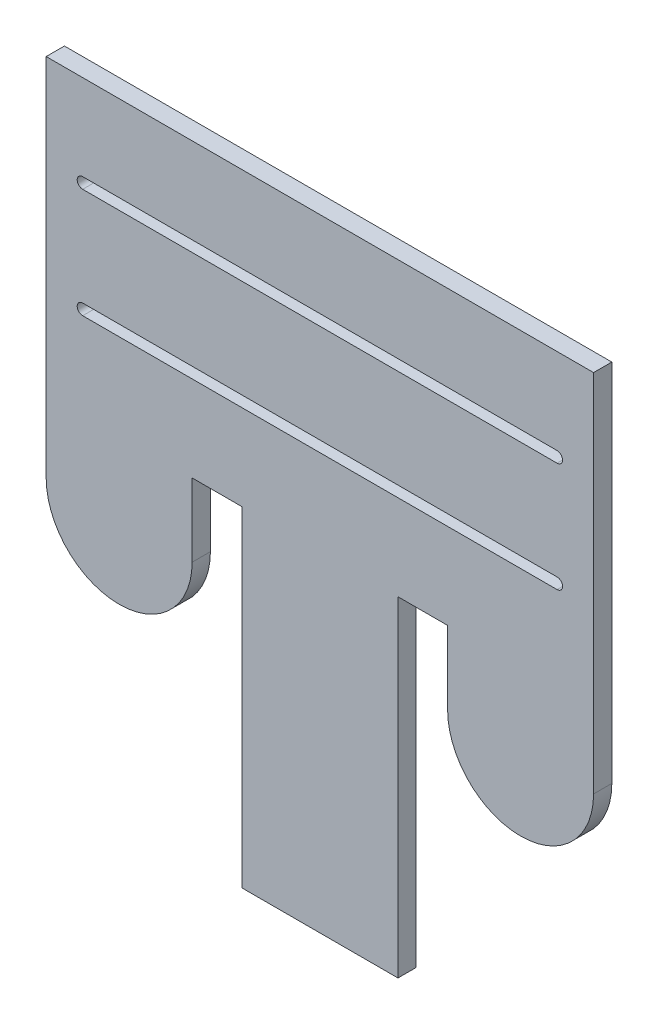
ISO-10303-21;
HEADER;
FILE_DESCRIPTION(('STEP AP214'),'2;1');
FILE_NAME('part.step','',(''),(''),'','','');
FILE_SCHEMA(('AUTOMOTIVE_DESIGN { 1 0 10303 214 1 1 1 1 }'));
ENDSEC;
DATA;
#1=APPLICATION_CONTEXT('core data for automotive mechanical design processes');
#2=APPLICATION_PROTOCOL_DEFINITION('international standard','automotive_design',2000,#1);
#3=PRODUCT_CONTEXT('',#1,'mechanical');
#4=PRODUCT('Part','Part','',(#3));
#5=PRODUCT_RELATED_PRODUCT_CATEGORY('part','',(#4));
#6=PRODUCT_DEFINITION_FORMATION('','',#4);
#7=PRODUCT_DEFINITION_CONTEXT('part definition',#1,'design');
#8=PRODUCT_DEFINITION('design','',#6,#7);
#9=PRODUCT_DEFINITION_SHAPE('','',#8);
#10=(LENGTH_UNIT() NAMED_UNIT(*) SI_UNIT(.MILLI.,.METRE.));
#11=(NAMED_UNIT(*) PLANE_ANGLE_UNIT() SI_UNIT($,.RADIAN.));
#12=(NAMED_UNIT(*) SI_UNIT($,.STERADIAN.) SOLID_ANGLE_UNIT());
#13=UNCERTAINTY_MEASURE_WITH_UNIT(LENGTH_MEASURE(1.E-05),#10,'distance_accuracy_value','');
#14=(GEOMETRIC_REPRESENTATION_CONTEXT(3) GLOBAL_UNCERTAINTY_ASSIGNED_CONTEXT((#13)) GLOBAL_UNIT_ASSIGNED_CONTEXT((#10,
#11,#12)) REPRESENTATION_CONTEXT('',''));
#15=CARTESIAN_POINT('',(0.,0.,0.));
#16=DIRECTION('',(0.,0.,1.));
#17=DIRECTION('',(1.,0.,0.));
#18=AXIS2_PLACEMENT_3D('',#15,#16,#17);
#19=CARTESIAN_POINT('',(0.,0.,0.));
#20=DIRECTION('',(0.,-1.,0.));
#21=DIRECTION('',(0.,0.,-1.));
#22=AXIS2_PLACEMENT_3D('',#19,#20,#21);
#23=PLANE('',#22);
#24=DIRECTION('',(1.,0.,0.));
#25=VECTOR('',#24,1.);
#26=CARTESIAN_POINT('',(0.,0.,0.));
#27=LINE('',#26,#25);
#28=CARTESIAN_POINT('',(122.428,0.,0.));
#29=VERTEX_POINT('',#28);
#30=CARTESIAN_POINT('',(139.7,0.,0.));
#31=VERTEX_POINT('',#30);
#32=EDGE_CURVE('E219',#29,#31,#27,.T.);
#33=ORIENTED_EDGE('',*,*,#32,.F.);
#34=DIRECTION('',(0.,0.,1.));
#35=VECTOR('',#34,1.);
#36=CARTESIAN_POINT('',(122.428,0.,0.));
#37=LINE('',#36,#35);
#38=CARTESIAN_POINT('',(122.428,0.,-6.35));
#39=VERTEX_POINT('',#38);
#40=EDGE_CURVE('E208',#39,#29,#37,.T.);
#41=ORIENTED_EDGE('',*,*,#40,.F.);
#42=DIRECTION('',(-1.,0.,0.));
#43=VECTOR('',#42,1.);
#44=CARTESIAN_POINT('',(0.,0.,-6.35));
#45=LINE('',#44,#43);
#46=CARTESIAN_POINT('',(139.7,0.,-6.35));
#47=VERTEX_POINT('',#46);
#48=EDGE_CURVE('E214',#47,#39,#45,.T.);
#49=ORIENTED_EDGE('',*,*,#48,.F.);
#50=DIRECTION('',(0.,0.,1.));
#51=VECTOR('',#50,1.);
#52=CARTESIAN_POINT('',(139.7,0.,-78.1920489685532));
#53=LINE('',#52,#51);
#54=EDGE_CURVE('E263',#47,#31,#53,.T.);
#55=ORIENTED_EDGE('',*,*,#54,.T.);
#56=EDGE_LOOP('',(#33,#41,#49,#55));
#57=FACE_BOUND('',#56,.T.);
#58=ADVANCED_FACE('F40',(#57),#23,.T.);
#59=CARTESIAN_POINT('',(68.072,0.,-6.35));
#60=VERTEX_POINT('',#59);
#61=CARTESIAN_POINT('',(50.8,0.,-6.35));
#62=VERTEX_POINT('',#61);
#63=EDGE_CURVE('E196',#60,#62,#45,.T.);
#64=ORIENTED_EDGE('',*,*,#63,.F.);
#65=DIRECTION('',(0.,0.,-1.));
#66=VECTOR('',#65,1.);
#67=CARTESIAN_POINT('',(68.072,0.,0.));
#68=LINE('',#67,#66);
#69=CARTESIAN_POINT('',(68.072,0.,0.));
#70=VERTEX_POINT('',#69);
#71=EDGE_CURVE('E203',#70,#60,#68,.T.);
#72=ORIENTED_EDGE('',*,*,#71,.F.);
#73=CARTESIAN_POINT('',(50.8,0.,0.));
#74=VERTEX_POINT('',#73);
#75=EDGE_CURVE('E215',#74,#70,#27,.T.);
#76=ORIENTED_EDGE('',*,*,#75,.F.);
#77=DIRECTION('',(0.,0.,1.));
#78=VECTOR('',#77,1.);
#79=CARTESIAN_POINT('',(50.8,0.,-78.1920489685532));
#80=LINE('',#79,#78);
#81=EDGE_CURVE('E212',#62,#74,#80,.T.);
#82=ORIENTED_EDGE('',*,*,#81,.F.);
#83=EDGE_LOOP('',(#64,#72,#76,#82));
#84=FACE_BOUND('',#83,.T.);
#85=ADVANCED_FACE('F210',(#84),#23,.T.);
#86=CARTESIAN_POINT('',(0.,101.6,0.));
#87=DIRECTION('',(1.,0.,0.));
#88=DIRECTION('',(0.,0.,-1.));
#89=AXIS2_PLACEMENT_3D('',#86,#87,#88);
#90=PLANE('',#89);
#91=DIRECTION('',(0.,-1.,0.));
#92=VECTOR('',#91,1.);
#93=CARTESIAN_POINT('',(0.,101.6,-6.35));
#94=LINE('',#93,#92);
#95=CARTESIAN_POINT('',(0.,101.6,-6.35));
#96=VERTEX_POINT('',#95);
#97=CARTESIAN_POINT('',(0.,-25.4,-6.35));
#98=VERTEX_POINT('',#97);
#99=EDGE_CURVE('E223',#96,#98,#94,.T.);
#100=ORIENTED_EDGE('',*,*,#99,.T.);
#101=DIRECTION('',(0.,0.,1.));
#102=VECTOR('',#101,1.);
#103=CARTESIAN_POINT('',(0.,-25.4,0.));
#104=LINE('',#103,#102);
#105=CARTESIAN_POINT('',(0.,-25.4,0.));
#106=VERTEX_POINT('',#105);
#107=EDGE_CURVE('E253',#98,#106,#104,.T.);
#108=ORIENTED_EDGE('',*,*,#107,.T.);
#109=DIRECTION('',(0.,-1.,0.));
#110=VECTOR('',#109,1.);
#111=CARTESIAN_POINT('',(0.,101.6,0.));
#112=LINE('',#111,#110);
#113=CARTESIAN_POINT('',(0.,101.6,0.));
#114=VERTEX_POINT('',#113);
#115=EDGE_CURVE('E232',#114,#106,#112,.T.);
#116=ORIENTED_EDGE('',*,*,#115,.F.);
#117=DIRECTION('',(0.,0.,1.));
#118=VECTOR('',#117,1.);
#119=CARTESIAN_POINT('',(0.,101.6,0.));
#120=LINE('',#119,#118);
#121=EDGE_CURVE('E218',#96,#114,#120,.T.);
#122=ORIENTED_EDGE('',*,*,#121,.F.);
#123=EDGE_LOOP('',(#100,#108,#116,#122));
#124=FACE_BOUND('',#123,.T.);
#125=ADVANCED_FACE('F369',(#124),#90,.F.);
#126=CARTESIAN_POINT('',(0.,101.6,0.));
#127=DIRECTION('',(0.,0.,-1.));
#128=DIRECTION('',(-1.,0.,0.));
#129=AXIS2_PLACEMENT_3D('',#126,#127,#128);
#130=PLANE('',#129);
#131=DIRECTION('',(1.,0.,0.));
#132=VECTOR('',#131,1.);
#133=CARTESIAN_POINT('',(177.8,71.755,0.));
#134=LINE('',#133,#132);
#135=CARTESIAN_POINT('',(12.7,71.755,0.));
#136=VERTEX_POINT('',#135);
#137=CARTESIAN_POINT('',(177.8,71.755,0.));
#138=VERTEX_POINT('',#137);
#139=EDGE_CURVE('E302',#136,#138,#134,.T.);
#140=ORIENTED_EDGE('',*,*,#139,.T.);
#141=CARTESIAN_POINT('',(177.8,69.85,0.));
#142=DIRECTION('',(0.,0.,-1.));
#143=DIRECTION('',(-1.,0.,0.));
#144=AXIS2_PLACEMENT_3D('',#141,#142,#143);
#145=CIRCLE('',#144,1.905);
#146=CARTESIAN_POINT('',(177.8,67.945,0.));
#147=VERTEX_POINT('',#146);
#148=EDGE_CURVE('E292',#138,#147,#145,.T.);
#149=ORIENTED_EDGE('',*,*,#148,.T.);
#150=DIRECTION('',(-1.,0.,0.));
#151=VECTOR('',#150,1.);
#152=CARTESIAN_POINT('',(177.8,67.945,0.));
#153=LINE('',#152,#151);
#154=CARTESIAN_POINT('',(12.7,67.945,0.));
#155=VERTEX_POINT('',#154);
#156=EDGE_CURVE('E295',#147,#155,#153,.T.);
#157=ORIENTED_EDGE('',*,*,#156,.T.);
#158=CARTESIAN_POINT('',(12.7,69.85,0.));
#159=DIRECTION('',(0.,0.,-1.));
#160=DIRECTION('',(1.,0.,0.));
#161=AXIS2_PLACEMENT_3D('',#158,#159,#160);
#162=CIRCLE('',#161,1.905);
#163=EDGE_CURVE('E299',#155,#136,#162,.T.);
#164=ORIENTED_EDGE('',*,*,#163,.T.);
#165=EDGE_LOOP('',(#140,#149,#157,#164));
#166=FACE_BOUND('',#165,.T.);
#167=DIRECTION('',(-1.,0.,0.));
#168=VECTOR('',#167,1.);
#169=CARTESIAN_POINT('',(177.8,29.845,0.));
#170=LINE('',#169,#168);
#171=CARTESIAN_POINT('',(177.8,29.845,0.));
#172=VERTEX_POINT('',#171);
#173=CARTESIAN_POINT('',(12.7,29.845,0.));
#174=VERTEX_POINT('',#173);
#175=EDGE_CURVE('E335',#172,#174,#170,.T.);
#176=ORIENTED_EDGE('',*,*,#175,.T.);
#177=CARTESIAN_POINT('',(12.7,31.75,0.));
#178=DIRECTION('',(0.,0.,-1.));
#179=DIRECTION('',(-1.,0.,0.));
#180=AXIS2_PLACEMENT_3D('',#177,#178,#179);
#181=CIRCLE('',#180,1.905);
#182=CARTESIAN_POINT('',(12.7,33.655,0.));
#183=VERTEX_POINT('',#182);
#184=EDGE_CURVE('E325',#174,#183,#181,.T.);
#185=ORIENTED_EDGE('',*,*,#184,.T.);
#186=DIRECTION('',(1.,0.,0.));
#187=VECTOR('',#186,1.);
#188=CARTESIAN_POINT('',(177.8,33.655,0.));
#189=LINE('',#188,#187);
#190=CARTESIAN_POINT('',(177.8,33.655,0.));
#191=VERTEX_POINT('',#190);
#192=EDGE_CURVE('E328',#183,#191,#189,.T.);
#193=ORIENTED_EDGE('',*,*,#192,.T.);
#194=CARTESIAN_POINT('',(177.8,31.75,0.));
#195=DIRECTION('',(0.,0.,-1.));
#196=DIRECTION('',(1.,0.,0.));
#197=AXIS2_PLACEMENT_3D('',#194,#195,#196);
#198=CIRCLE('',#197,1.905);
#199=EDGE_CURVE('E332',#191,#172,#198,.T.);
#200=ORIENTED_EDGE('',*,*,#199,.T.);
#201=EDGE_LOOP('',(#176,#185,#193,#200));
#202=FACE_BOUND('',#201,.T.);
#203=ORIENTED_EDGE('',*,*,#115,.T.);
#204=CARTESIAN_POINT('',(25.4,-25.4,0.));
#205=DIRECTION('',(0.,0.,-1.));
#206=DIRECTION('',(-1.,0.,0.));
#207=AXIS2_PLACEMENT_3D('',#204,#205,#206);
#208=CIRCLE('',#207,25.4);
#209=CARTESIAN_POINT('',(25.4,-50.8,0.));
#210=VERTEX_POINT('',#209);
#211=EDGE_CURVE('E244',#106,#210,#208,.F.);
#212=ORIENTED_EDGE('',*,*,#211,.T.);
#213=CARTESIAN_POINT('',(25.4,-25.4,0.));
#214=DIRECTION('',(0.,0.,-1.));
#215=DIRECTION('',(-1.,0.,0.));
#216=AXIS2_PLACEMENT_3D('',#213,#214,#215);
#217=CIRCLE('',#216,25.4);
#218=CARTESIAN_POINT('',(50.8,-25.4,0.));
#219=VERTEX_POINT('',#218);
#220=EDGE_CURVE('E242',#210,#219,#217,.F.);
#221=ORIENTED_EDGE('',*,*,#220,.T.);
#222=DIRECTION('',(0.,1.,0.));
#223=VECTOR('',#222,1.);
#224=CARTESIAN_POINT('',(50.8,0.,0.));
#225=LINE('',#224,#223);
#226=EDGE_CURVE('E283',#219,#74,#225,.T.);
#227=ORIENTED_EDGE('',*,*,#226,.T.);
#228=ORIENTED_EDGE('',*,*,#75,.T.);
#229=DIRECTION('',(0.,1.,0.));
#230=VECTOR('',#229,1.);
#231=CARTESIAN_POINT('',(68.072,-169.627254276582,0.));
#232=LINE('',#231,#230);
#233=CARTESIAN_POINT('',(68.072,-114.9016,0.));
#234=VERTEX_POINT('',#233);
#235=EDGE_CURVE('E57',#234,#70,#232,.T.);
#236=ORIENTED_EDGE('',*,*,#235,.F.);
#237=DIRECTION('',(1.,0.,0.));
#238=VECTOR('',#237,1.);
#239=CARTESIAN_POINT('',(68.072,-114.9016,0.));
#240=LINE('',#239,#238);
#241=CARTESIAN_POINT('',(122.428,-114.9016,0.));
#242=VERTEX_POINT('',#241);
#243=EDGE_CURVE('E200',#234,#242,#240,.T.);
#244=ORIENTED_EDGE('',*,*,#243,.T.);
#245=DIRECTION('',(0.,1.,0.));
#246=VECTOR('',#245,1.);
#247=CARTESIAN_POINT('',(122.428,-169.627254276582,0.));
#248=LINE('',#247,#246);
#249=EDGE_CURVE('E277',#242,#29,#248,.T.);
#250=ORIENTED_EDGE('',*,*,#249,.T.);
#251=ORIENTED_EDGE('',*,*,#32,.T.);
#252=DIRECTION('',(0.,-1.,0.));
#253=VECTOR('',#252,1.);
#254=CARTESIAN_POINT('',(139.7,0.,0.));
#255=LINE('',#254,#253);
#256=CARTESIAN_POINT('',(139.7,-25.4,0.));
#257=VERTEX_POINT('',#256);
#258=EDGE_CURVE('E258',#31,#257,#255,.T.);
#259=ORIENTED_EDGE('',*,*,#258,.T.);
#260=CARTESIAN_POINT('',(165.1,-25.4,0.));
#261=DIRECTION('',(0.,0.,-1.));
#262=DIRECTION('',(-1.,0.,0.));
#263=AXIS2_PLACEMENT_3D('',#260,#261,#262);
#264=CIRCLE('',#263,25.4);
#265=CARTESIAN_POINT('',(165.1,-50.8,0.));
#266=VERTEX_POINT('',#265);
#267=EDGE_CURVE('E240',#257,#266,#264,.F.);
#268=ORIENTED_EDGE('',*,*,#267,.T.);
#269=CARTESIAN_POINT('',(165.1,-25.4,0.));
#270=DIRECTION('',(0.,0.,-1.));
#271=DIRECTION('',(-1.,0.,0.));
#272=AXIS2_PLACEMENT_3D('',#269,#270,#271);
#273=CIRCLE('',#272,25.4);
#274=CARTESIAN_POINT('',(190.5,-25.4,0.));
#275=VERTEX_POINT('',#274);
#276=EDGE_CURVE('E238',#266,#275,#273,.F.);
#277=ORIENTED_EDGE('',*,*,#276,.T.);
#278=DIRECTION('',(0.,-1.,0.));
#279=VECTOR('',#278,1.);
#280=CARTESIAN_POINT('',(190.5,101.6,0.));
#281=LINE('',#280,#279);
#282=CARTESIAN_POINT('',(190.5,101.6,0.));
#283=VERTEX_POINT('',#282);
#284=EDGE_CURVE('E229',#283,#275,#281,.T.);
#285=ORIENTED_EDGE('',*,*,#284,.F.);
#286=DIRECTION('',(1.,0.,0.));
#287=VECTOR('',#286,1.);
#288=CARTESIAN_POINT('',(0.,101.6,0.));
#289=LINE('',#288,#287);
#290=EDGE_CURVE('E357',#114,#283,#289,.T.);
#291=ORIENTED_EDGE('',*,*,#290,.F.);
#292=EDGE_LOOP('',(#203,#212,#221,#227,#228,#236,#244,#250,#251,#259,#268,#277,#285,#291));
#293=FACE_BOUND('',#292,.T.);
#294=ADVANCED_FACE('F371',(#166,#202,#293),#130,.F.);
#295=CARTESIAN_POINT('',(190.5,101.6,0.));
#296=DIRECTION('',(-1.,0.,0.));
#297=DIRECTION('',(0.,0.,1.));
#298=AXIS2_PLACEMENT_3D('',#295,#296,#297);
#299=PLANE('',#298);
#300=ORIENTED_EDGE('',*,*,#284,.T.);
#301=DIRECTION('',(0.,0.,1.));
#302=VECTOR('',#301,1.);
#303=CARTESIAN_POINT('',(190.5,-25.4,-6.34999999999999));
#304=LINE('',#303,#302);
#305=CARTESIAN_POINT('',(190.5,-25.4,-6.35));
#306=VERTEX_POINT('',#305);
#307=EDGE_CURVE('E11',#275,#306,#304,.F.);
#308=ORIENTED_EDGE('',*,*,#307,.T.);
#309=DIRECTION('',(0.,-1.,0.));
#310=VECTOR('',#309,1.);
#311=CARTESIAN_POINT('',(190.5,101.6,-6.35));
#312=LINE('',#311,#310);
#313=CARTESIAN_POINT('',(190.5,101.6,-6.35));
#314=VERTEX_POINT('',#313);
#315=EDGE_CURVE('E225',#314,#306,#312,.T.);
#316=ORIENTED_EDGE('',*,*,#315,.F.);
#317=DIRECTION('',(0.,0.,-1.));
#318=VECTOR('',#317,1.);
#319=CARTESIAN_POINT('',(190.5,101.6,0.));
#320=LINE('',#319,#318);
#321=EDGE_CURVE('E359',#283,#314,#320,.T.);
#322=ORIENTED_EDGE('',*,*,#321,.F.);
#323=EDGE_LOOP('',(#300,#308,#316,#322));
#324=FACE_BOUND('',#323,.T.);
#325=ADVANCED_FACE('F377',(#324),#299,.F.);
#326=CARTESIAN_POINT('',(0.,101.6,-6.35));
#327=DIRECTION('',(0.,0.,1.));
#328=DIRECTION('',(1.,0.,0.));
#329=AXIS2_PLACEMENT_3D('',#326,#327,#328);
#330=PLANE('',#329);
#331=DIRECTION('',(-1.,0.,0.));
#332=VECTOR('',#331,1.);
#333=CARTESIAN_POINT('',(177.8,67.945,-6.35));
#334=LINE('',#333,#332);
#335=CARTESIAN_POINT('',(177.8,67.945,-6.35));
#336=VERTEX_POINT('',#335);
#337=CARTESIAN_POINT('',(12.7,67.945,-6.35));
#338=VERTEX_POINT('',#337);
#339=EDGE_CURVE('E308',#336,#338,#334,.T.);
#340=ORIENTED_EDGE('',*,*,#339,.F.);
#341=CARTESIAN_POINT('',(177.8,69.85,-6.35));
#342=DIRECTION('',(0.,0.,-1.));
#343=DIRECTION('',(-1.,0.,0.));
#344=AXIS2_PLACEMENT_3D('',#341,#342,#343);
#345=CIRCLE('',#344,1.905);
#346=CARTESIAN_POINT('',(177.8,71.755,-6.35));
#347=VERTEX_POINT('',#346);
#348=EDGE_CURVE('E306',#347,#336,#345,.T.);
#349=ORIENTED_EDGE('',*,*,#348,.F.);
#350=DIRECTION('',(1.,0.,0.));
#351=VECTOR('',#350,1.);
#352=CARTESIAN_POINT('',(177.8,71.755,-6.35));
#353=LINE('',#352,#351);
#354=CARTESIAN_POINT('',(12.7,71.755,-6.35));
#355=VERTEX_POINT('',#354);
#356=EDGE_CURVE('E296',#355,#347,#353,.T.);
#357=ORIENTED_EDGE('',*,*,#356,.F.);
#358=CARTESIAN_POINT('',(12.7,69.85,-6.35));
#359=DIRECTION('',(0.,0.,-1.));
#360=DIRECTION('',(1.,0.,0.));
#361=AXIS2_PLACEMENT_3D('',#358,#359,#360);
#362=CIRCLE('',#361,1.905);
#363=EDGE_CURVE('E312',#338,#355,#362,.T.);
#364=ORIENTED_EDGE('',*,*,#363,.F.);
#365=EDGE_LOOP('',(#340,#349,#357,#364));
#366=FACE_BOUND('',#365,.T.);
#367=DIRECTION('',(1.,0.,0.));
#368=VECTOR('',#367,1.);
#369=CARTESIAN_POINT('',(177.8,33.655,-6.35));
#370=LINE('',#369,#368);
#371=CARTESIAN_POINT('',(12.7,33.655,-6.35));
#372=VERTEX_POINT('',#371);
#373=CARTESIAN_POINT('',(177.8,33.655,-6.35));
#374=VERTEX_POINT('',#373);
#375=EDGE_CURVE('E340',#372,#374,#370,.T.);
#376=ORIENTED_EDGE('',*,*,#375,.F.);
#377=CARTESIAN_POINT('',(12.7,31.75,-6.35));
#378=DIRECTION('',(0.,0.,-1.));
#379=DIRECTION('',(-1.,0.,0.));
#380=AXIS2_PLACEMENT_3D('',#377,#378,#379);
#381=CIRCLE('',#380,1.905);
#382=CARTESIAN_POINT('',(12.7,29.845,-6.35));
#383=VERTEX_POINT('',#382);
#384=EDGE_CURVE('E289',#383,#372,#381,.T.);
#385=ORIENTED_EDGE('',*,*,#384,.F.);
#386=DIRECTION('',(-1.,0.,0.));
#387=VECTOR('',#386,1.);
#388=CARTESIAN_POINT('',(177.8,29.845,-6.35));
#389=LINE('',#388,#387);
#390=CARTESIAN_POINT('',(177.8,29.845,-6.35));
#391=VERTEX_POINT('',#390);
#392=EDGE_CURVE('E329',#391,#383,#389,.T.);
#393=ORIENTED_EDGE('',*,*,#392,.F.);
#394=CARTESIAN_POINT('',(177.8,31.75,-6.35));
#395=DIRECTION('',(0.,0.,-1.));
#396=DIRECTION('',(1.,0.,0.));
#397=AXIS2_PLACEMENT_3D('',#394,#395,#396);
#398=CIRCLE('',#397,1.905);
#399=EDGE_CURVE('E343',#374,#391,#398,.T.);
#400=ORIENTED_EDGE('',*,*,#399,.F.);
#401=EDGE_LOOP('',(#376,#385,#393,#400));
#402=FACE_BOUND('',#401,.T.);
#403=CARTESIAN_POINT('',(25.4,-25.4,-6.34999999999999));
#404=DIRECTION('',(0.,0.,1.));
#405=DIRECTION('',(1.,0.,0.));
#406=AXIS2_PLACEMENT_3D('',#403,#404,#405);
#407=CIRCLE('',#406,25.4);
#408=CARTESIAN_POINT('',(50.8,-25.4,-6.34999999999999));
#409=VERTEX_POINT('',#408);
#410=CARTESIAN_POINT('',(25.4,-50.8,-6.34999999999999));
#411=VERTEX_POINT('',#410);
#412=EDGE_CURVE('E250',#409,#411,#407,.F.);
#413=ORIENTED_EDGE('',*,*,#412,.T.);
#414=CARTESIAN_POINT('',(25.4,-25.4,-6.35));
#415=DIRECTION('',(0.,0.,1.));
#416=DIRECTION('',(1.,0.,0.));
#417=AXIS2_PLACEMENT_3D('',#414,#415,#416);
#418=CIRCLE('',#417,25.4);
#419=EDGE_CURVE('E65',#411,#98,#418,.F.);
#420=ORIENTED_EDGE('',*,*,#419,.T.);
#421=ORIENTED_EDGE('',*,*,#99,.F.);
#422=DIRECTION('',(-1.,0.,0.));
#423=VECTOR('',#422,1.);
#424=CARTESIAN_POINT('',(0.,101.6,-6.35));
#425=LINE('',#424,#423);
#426=EDGE_CURVE('E226',#314,#96,#425,.T.);
#427=ORIENTED_EDGE('',*,*,#426,.F.);
#428=ORIENTED_EDGE('',*,*,#315,.T.);
#429=CARTESIAN_POINT('',(165.1,-25.4,-6.34999999999999));
#430=DIRECTION('',(0.,0.,1.));
#431=DIRECTION('',(1.,0.,0.));
#432=AXIS2_PLACEMENT_3D('',#429,#430,#431);
#433=CIRCLE('',#432,25.4);
#434=CARTESIAN_POINT('',(165.1,-50.8,-6.34999999999999));
#435=VERTEX_POINT('',#434);
#436=EDGE_CURVE('E246',#306,#435,#433,.F.);
#437=ORIENTED_EDGE('',*,*,#436,.T.);
#438=CARTESIAN_POINT('',(165.1,-25.4,-6.34999999999999));
#439=DIRECTION('',(0.,0.,1.));
#440=DIRECTION('',(1.,0.,0.));
#441=AXIS2_PLACEMENT_3D('',#438,#439,#440);
#442=CIRCLE('',#441,25.4);
#443=CARTESIAN_POINT('',(139.7,-25.4,-6.34999999999999));
#444=VERTEX_POINT('',#443);
#445=EDGE_CURVE('E248',#435,#444,#442,.F.);
#446=ORIENTED_EDGE('',*,*,#445,.T.);
#447=DIRECTION('',(0.,1.,0.));
#448=VECTOR('',#447,1.);
#449=CARTESIAN_POINT('',(139.7,0.,-6.34999999999999));
#450=LINE('',#449,#448);
#451=EDGE_CURVE('E282',#444,#47,#450,.T.);
#452=ORIENTED_EDGE('',*,*,#451,.T.);
#453=ORIENTED_EDGE('',*,*,#48,.T.);
#454=DIRECTION('',(0.,1.,0.));
#455=VECTOR('',#454,1.);
#456=CARTESIAN_POINT('',(122.428,-169.627254276582,-6.35));
#457=LINE('',#456,#455);
#458=CARTESIAN_POINT('',(122.428,-114.9016,-6.35));
#459=VERTEX_POINT('',#458);
#460=EDGE_CURVE('E201',#459,#39,#457,.T.);
#461=ORIENTED_EDGE('',*,*,#460,.F.);
#462=DIRECTION('',(-1.,0.,0.));
#463=VECTOR('',#462,1.);
#464=CARTESIAN_POINT('',(68.072,-114.9016,-6.35));
#465=LINE('',#464,#463);
#466=CARTESIAN_POINT('',(68.072,-114.9016,-6.35));
#467=VERTEX_POINT('',#466);
#468=EDGE_CURVE('E199',#459,#467,#465,.T.);
#469=ORIENTED_EDGE('',*,*,#468,.T.);
#470=DIRECTION('',(0.,1.,0.));
#471=VECTOR('',#470,1.);
#472=CARTESIAN_POINT('',(68.072,-169.627254276582,-6.35));
#473=LINE('',#472,#471);
#474=EDGE_CURVE('E192',#467,#60,#473,.T.);
#475=ORIENTED_EDGE('',*,*,#474,.T.);
#476=ORIENTED_EDGE('',*,*,#63,.T.);
#477=DIRECTION('',(0.,-1.,0.));
#478=VECTOR('',#477,1.);
#479=CARTESIAN_POINT('',(50.8,0.,-6.34999999999999));
#480=LINE('',#479,#478);
#481=EDGE_CURVE('E287',#62,#409,#480,.T.);
#482=ORIENTED_EDGE('',*,*,#481,.T.);
#483=EDGE_LOOP('',(#413,#420,#421,#427,#428,#437,#446,#452,#453,#461,#469,#475,#476,#482));
#484=FACE_BOUND('',#483,.T.);
#485=ADVANCED_FACE('F193',(#366,#402,#484),#330,.F.);
#486=CARTESIAN_POINT('',(0.,101.6,0.));
#487=DIRECTION('',(0.,-1.,0.));
#488=DIRECTION('',(0.,0.,-1.));
#489=AXIS2_PLACEMENT_3D('',#486,#487,#488);
#490=PLANE('',#489);
#491=ORIENTED_EDGE('',*,*,#121,.T.);
#492=ORIENTED_EDGE('',*,*,#290,.T.);
#493=ORIENTED_EDGE('',*,*,#321,.T.);
#494=ORIENTED_EDGE('',*,*,#426,.T.);
#495=EDGE_LOOP('',(#491,#492,#493,#494));
#496=FACE_BOUND('',#495,.T.);
#497=ADVANCED_FACE('F362',(#496),#490,.F.);
#498=CARTESIAN_POINT('',(12.7,31.75,0.));
#499=DIRECTION('',(0.,0.,-1.));
#500=DIRECTION('',(-1.,0.,0.));
#501=AXIS2_PLACEMENT_3D('',#498,#499,#500);
#502=CYLINDRICAL_SURFACE('',#501,1.905);
#503=ORIENTED_EDGE('',*,*,#384,.T.);
#504=DIRECTION('',(0.,0.,-1.));
#505=VECTOR('',#504,1.);
#506=CARTESIAN_POINT('',(12.7,33.655,0.));
#507=LINE('',#506,#505);
#508=EDGE_CURVE('E338',#183,#372,#507,.T.);
#509=ORIENTED_EDGE('',*,*,#508,.F.);
#510=ORIENTED_EDGE('',*,*,#184,.F.);
#511=DIRECTION('',(0.,0.,-1.));
#512=VECTOR('',#511,1.);
#513=CARTESIAN_POINT('',(12.7,29.845,0.));
#514=LINE('',#513,#512);
#515=EDGE_CURVE('E309',#174,#383,#514,.T.);
#516=ORIENTED_EDGE('',*,*,#515,.T.);
#517=EDGE_LOOP('',(#503,#509,#510,#516));
#518=FACE_BOUND('',#517,.T.);
#519=ADVANCED_FACE('F463',(#518),#502,.F.);
#520=CARTESIAN_POINT('',(177.8,29.845,0.));
#521=DIRECTION('',(0.,-1.,0.));
#522=DIRECTION('',(0.,0.,-1.));
#523=AXIS2_PLACEMENT_3D('',#520,#521,#522);
#524=PLANE('',#523);
#525=ORIENTED_EDGE('',*,*,#392,.T.);
#526=ORIENTED_EDGE('',*,*,#515,.F.);
#527=ORIENTED_EDGE('',*,*,#175,.F.);
#528=DIRECTION('',(0.,0.,-1.));
#529=VECTOR('',#528,1.);
#530=CARTESIAN_POINT('',(177.8,29.845,0.));
#531=LINE('',#530,#529);
#532=EDGE_CURVE('E349',#172,#391,#531,.T.);
#533=ORIENTED_EDGE('',*,*,#532,.T.);
#534=EDGE_LOOP('',(#525,#526,#527,#533));
#535=FACE_BOUND('',#534,.T.);
#536=ADVANCED_FACE('F459',(#535),#524,.F.);
#537=CARTESIAN_POINT('',(177.8,31.75,0.));
#538=DIRECTION('',(0.,0.,-1.));
#539=DIRECTION('',(-1.,0.,0.));
#540=AXIS2_PLACEMENT_3D('',#537,#538,#539);
#541=CYLINDRICAL_SURFACE('',#540,1.905);
#542=ORIENTED_EDGE('',*,*,#399,.T.);
#543=ORIENTED_EDGE('',*,*,#532,.F.);
#544=ORIENTED_EDGE('',*,*,#199,.F.);
#545=DIRECTION('',(0.,0.,-1.));
#546=VECTOR('',#545,1.);
#547=CARTESIAN_POINT('',(177.8,33.655,0.));
#548=LINE('',#547,#546);
#549=EDGE_CURVE('E351',#191,#374,#548,.T.);
#550=ORIENTED_EDGE('',*,*,#549,.T.);
#551=EDGE_LOOP('',(#542,#543,#544,#550));
#552=FACE_BOUND('',#551,.T.);
#553=ADVANCED_FACE('F462',(#552),#541,.F.);
#554=CARTESIAN_POINT('',(177.8,33.655,0.));
#555=DIRECTION('',(0.,1.,0.));
#556=DIRECTION('',(0.,0.,1.));
#557=AXIS2_PLACEMENT_3D('',#554,#555,#556);
#558=PLANE('',#557);
#559=ORIENTED_EDGE('',*,*,#375,.T.);
#560=ORIENTED_EDGE('',*,*,#549,.F.);
#561=ORIENTED_EDGE('',*,*,#192,.F.);
#562=ORIENTED_EDGE('',*,*,#508,.T.);
#563=EDGE_LOOP('',(#559,#560,#561,#562));
#564=FACE_BOUND('',#563,.T.);
#565=ADVANCED_FACE('F457',(#564),#558,.F.);
#566=CARTESIAN_POINT('',(177.8,69.85,0.));
#567=DIRECTION('',(0.,0.,-1.));
#568=DIRECTION('',(-1.,0.,0.));
#569=AXIS2_PLACEMENT_3D('',#566,#567,#568);
#570=CYLINDRICAL_SURFACE('',#569,1.905);
#571=ORIENTED_EDGE('',*,*,#348,.T.);
#572=DIRECTION('',(0.,0.,-1.));
#573=VECTOR('',#572,1.);
#574=CARTESIAN_POINT('',(177.8,67.945,0.));
#575=LINE('',#574,#573);
#576=EDGE_CURVE('E305',#147,#336,#575,.T.);
#577=ORIENTED_EDGE('',*,*,#576,.F.);
#578=ORIENTED_EDGE('',*,*,#148,.F.);
#579=DIRECTION('',(0.,0.,-1.));
#580=VECTOR('',#579,1.);
#581=CARTESIAN_POINT('',(177.8,71.755,0.));
#582=LINE('',#581,#580);
#583=EDGE_CURVE('E317',#138,#347,#582,.T.);
#584=ORIENTED_EDGE('',*,*,#583,.T.);
#585=EDGE_LOOP('',(#571,#577,#578,#584));
#586=FACE_BOUND('',#585,.T.);
#587=ADVANCED_FACE('F447',(#586),#570,.F.);
#588=CARTESIAN_POINT('',(177.8,71.755,0.));
#589=DIRECTION('',(0.,1.,0.));
#590=DIRECTION('',(0.,0.,1.));
#591=AXIS2_PLACEMENT_3D('',#588,#589,#590);
#592=PLANE('',#591);
#593=ORIENTED_EDGE('',*,*,#356,.T.);
#594=ORIENTED_EDGE('',*,*,#583,.F.);
#595=ORIENTED_EDGE('',*,*,#139,.F.);
#596=DIRECTION('',(0.,0.,-1.));
#597=VECTOR('',#596,1.);
#598=CARTESIAN_POINT('',(12.7,71.755,0.));
#599=LINE('',#598,#597);
#600=EDGE_CURVE('E319',#136,#355,#599,.T.);
#601=ORIENTED_EDGE('',*,*,#600,.T.);
#602=EDGE_LOOP('',(#593,#594,#595,#601));
#603=FACE_BOUND('',#602,.T.);
#604=ADVANCED_FACE('F443',(#603),#592,.F.);
#605=CARTESIAN_POINT('',(12.7,69.85,0.));
#606=DIRECTION('',(0.,0.,-1.));
#607=DIRECTION('',(-1.,0.,0.));
#608=AXIS2_PLACEMENT_3D('',#605,#606,#607);
#609=CYLINDRICAL_SURFACE('',#608,1.905);
#610=ORIENTED_EDGE('',*,*,#363,.T.);
#611=ORIENTED_EDGE('',*,*,#600,.F.);
#612=ORIENTED_EDGE('',*,*,#163,.F.);
#613=DIRECTION('',(0.,0.,-1.));
#614=VECTOR('',#613,1.);
#615=CARTESIAN_POINT('',(12.7,67.945,0.));
#616=LINE('',#615,#614);
#617=EDGE_CURVE('E321',#155,#338,#616,.T.);
#618=ORIENTED_EDGE('',*,*,#617,.T.);
#619=EDGE_LOOP('',(#610,#611,#612,#618));
#620=FACE_BOUND('',#619,.T.);
#621=ADVANCED_FACE('F446',(#620),#609,.F.);
#622=CARTESIAN_POINT('',(177.8,67.945,0.));
#623=DIRECTION('',(0.,-1.,0.));
#624=DIRECTION('',(0.,0.,-1.));
#625=AXIS2_PLACEMENT_3D('',#622,#623,#624);
#626=PLANE('',#625);
#627=ORIENTED_EDGE('',*,*,#339,.T.);
#628=ORIENTED_EDGE('',*,*,#617,.F.);
#629=ORIENTED_EDGE('',*,*,#156,.F.);
#630=ORIENTED_EDGE('',*,*,#576,.T.);
#631=EDGE_LOOP('',(#627,#628,#629,#630));
#632=FACE_BOUND('',#631,.T.);
#633=ADVANCED_FACE('F439',(#632),#626,.F.);
#634=CARTESIAN_POINT('',(50.8,0.,-78.1920489685532));
#635=DIRECTION('',(1.,0.,0.));
#636=DIRECTION('',(0.,1.,0.));
#637=AXIS2_PLACEMENT_3D('',#634,#635,#636);
#638=PLANE('',#637);
#639=ORIENTED_EDGE('',*,*,#226,.F.);
#640=DIRECTION('',(0.,0.,1.));
#641=VECTOR('',#640,1.);
#642=CARTESIAN_POINT('',(50.8,-25.4,-78.1920489685532));
#643=LINE('',#642,#641);
#644=EDGE_CURVE('E49',#219,#409,#643,.F.);
#645=ORIENTED_EDGE('',*,*,#644,.T.);
#646=ORIENTED_EDGE('',*,*,#481,.F.);
#647=ORIENTED_EDGE('',*,*,#81,.T.);
#648=EDGE_LOOP('',(#639,#645,#646,#647));
#649=FACE_BOUND('',#648,.T.);
#650=ADVANCED_FACE('F400',(#649),#638,.T.);
#651=CARTESIAN_POINT('',(139.7,0.,-78.1920489685532));
#652=DIRECTION('',(-1.,0.,0.));
#653=DIRECTION('',(0.,-1.,0.));
#654=AXIS2_PLACEMENT_3D('',#651,#652,#653);
#655=PLANE('',#654);
#656=ORIENTED_EDGE('',*,*,#451,.F.);
#657=DIRECTION('',(0.,0.,1.));
#658=VECTOR('',#657,1.);
#659=CARTESIAN_POINT('',(139.7,-25.4,-78.1920489685532));
#660=LINE('',#659,#658);
#661=EDGE_CURVE('E235',#444,#257,#660,.T.);
#662=ORIENTED_EDGE('',*,*,#661,.T.);
#663=ORIENTED_EDGE('',*,*,#258,.F.);
#664=ORIENTED_EDGE('',*,*,#54,.F.);
#665=EDGE_LOOP('',(#656,#662,#663,#664));
#666=FACE_BOUND('',#665,.T.);
#667=ADVANCED_FACE('F386',(#666),#655,.T.);
#668=CARTESIAN_POINT('',(165.1,-25.4,-78.1920489685532));
#669=DIRECTION('',(0.,0.,-1.));
#670=DIRECTION('',(-1.,0.,0.));
#671=AXIS2_PLACEMENT_3D('',#668,#669,#670);
#672=CYLINDRICAL_SURFACE('',#671,25.4);
#673=DIRECTION('',(0.,0.,1.));
#674=VECTOR('',#673,1.);
#675=CARTESIAN_POINT('',(165.1,-50.8,0.));
#676=LINE('',#675,#674);
#677=EDGE_CURVE('E256',#435,#266,#676,.T.);
#678=ORIENTED_EDGE('',*,*,#677,.F.);
#679=ORIENTED_EDGE('',*,*,#436,.F.);
#680=ORIENTED_EDGE('',*,*,#307,.F.);
#681=ORIENTED_EDGE('',*,*,#276,.F.);
#682=EDGE_LOOP('',(#678,#679,#680,#681));
#683=FACE_BOUND('',#682,.T.);
#684=ADVANCED_FACE('F380',(#683),#672,.T.);
#685=CARTESIAN_POINT('',(165.1,-25.4,-78.1920489685532));
#686=DIRECTION('',(0.,0.,1.));
#687=DIRECTION('',(1.,0.,0.));
#688=AXIS2_PLACEMENT_3D('',#685,#686,#687);
#689=CYLINDRICAL_SURFACE('',#688,25.4);
#690=ORIENTED_EDGE('',*,*,#445,.F.);
#691=ORIENTED_EDGE('',*,*,#677,.T.);
#692=ORIENTED_EDGE('',*,*,#267,.F.);
#693=ORIENTED_EDGE('',*,*,#661,.F.);
#694=EDGE_LOOP('',(#690,#691,#692,#693));
#695=FACE_BOUND('',#694,.T.);
#696=ADVANCED_FACE('F382',(#695),#689,.T.);
#697=CARTESIAN_POINT('',(25.4,-25.4,-78.1920489685532));
#698=DIRECTION('',(0.,0.,1.));
#699=DIRECTION('',(1.,0.,0.));
#700=AXIS2_PLACEMENT_3D('',#697,#698,#699);
#701=CYLINDRICAL_SURFACE('',#700,25.4);
#702=DIRECTION('',(0.,0.,1.));
#703=VECTOR('',#702,1.);
#704=CARTESIAN_POINT('',(25.4,-50.8,-78.1920489685532));
#705=LINE('',#704,#703);
#706=EDGE_CURVE('E44',#411,#210,#705,.T.);
#707=ORIENTED_EDGE('',*,*,#706,.F.);
#708=ORIENTED_EDGE('',*,*,#412,.F.);
#709=ORIENTED_EDGE('',*,*,#644,.F.);
#710=ORIENTED_EDGE('',*,*,#220,.F.);
#711=EDGE_LOOP('',(#707,#708,#709,#710));
#712=FACE_BOUND('',#711,.T.);
#713=ADVANCED_FACE('F42',(#712),#701,.T.);
#714=CARTESIAN_POINT('',(25.4,-25.4,0.));
#715=DIRECTION('',(0.,0.,-1.));
#716=DIRECTION('',(-1.,0.,0.));
#717=AXIS2_PLACEMENT_3D('',#714,#715,#716);
#718=CYLINDRICAL_SURFACE('',#717,25.4);
#719=ORIENTED_EDGE('',*,*,#419,.F.);
#720=ORIENTED_EDGE('',*,*,#706,.T.);
#721=ORIENTED_EDGE('',*,*,#211,.F.);
#722=ORIENTED_EDGE('',*,*,#107,.F.);
#723=EDGE_LOOP('',(#719,#720,#721,#722));
#724=FACE_BOUND('',#723,.T.);
#725=ADVANCED_FACE('F404',(#724),#718,.T.);
#726=CARTESIAN_POINT('',(122.428,-169.627254276582,0.));
#727=DIRECTION('',(-1.,0.,0.));
#728=DIRECTION('',(0.,0.,1.));
#729=AXIS2_PLACEMENT_3D('',#726,#727,#728);
#730=PLANE('',#729);
#731=ORIENTED_EDGE('',*,*,#249,.F.);
#732=DIRECTION('',(0.,0.,-1.));
#733=VECTOR('',#732,1.);
#734=CARTESIAN_POINT('',(122.428,-114.9016,0.));
#735=LINE('',#734,#733);
#736=EDGE_CURVE('E270',#242,#459,#735,.T.);
#737=ORIENTED_EDGE('',*,*,#736,.T.);
#738=ORIENTED_EDGE('',*,*,#460,.T.);
#739=ORIENTED_EDGE('',*,*,#40,.T.);
#740=EDGE_LOOP('',(#731,#737,#738,#739));
#741=FACE_BOUND('',#740,.T.);
#742=ADVANCED_FACE('F395',(#741),#730,.F.);
#743=CARTESIAN_POINT('',(68.072,-169.627254276582,0.));
#744=DIRECTION('',(1.,0.,0.));
#745=DIRECTION('',(0.,0.,-1.));
#746=AXIS2_PLACEMENT_3D('',#743,#744,#745);
#747=PLANE('',#746);
#748=ORIENTED_EDGE('',*,*,#474,.F.);
#749=DIRECTION('',(0.,0.,1.));
#750=VECTOR('',#749,1.);
#751=CARTESIAN_POINT('',(68.072,-114.9016,0.));
#752=LINE('',#751,#750);
#753=EDGE_CURVE('E266',#467,#234,#752,.T.);
#754=ORIENTED_EDGE('',*,*,#753,.T.);
#755=ORIENTED_EDGE('',*,*,#235,.T.);
#756=ORIENTED_EDGE('',*,*,#71,.T.);
#757=EDGE_LOOP('',(#748,#754,#755,#756));
#758=FACE_BOUND('',#757,.T.);
#759=ADVANCED_FACE('F204',(#758),#747,.F.);
#760=CARTESIAN_POINT('',(-0.500000000000056,-114.9016,-6.35000000000003));
#761=DIRECTION('',(0.,1.,0.));
#762=DIRECTION('',(0.,0.,1.));
#763=AXIS2_PLACEMENT_3D('',#760,#761,#762);
#764=PLANE('',#763);
#765=ORIENTED_EDGE('',*,*,#468,.F.);
#766=ORIENTED_EDGE('',*,*,#736,.F.);
#767=ORIENTED_EDGE('',*,*,#243,.F.);
#768=ORIENTED_EDGE('',*,*,#753,.F.);
#769=EDGE_LOOP('',(#765,#766,#767,#768));
#770=FACE_BOUND('',#769,.T.);
#771=ADVANCED_FACE('F397',(#770),#764,.F.);
#772=CLOSED_SHELL('',(#58,#85,#125,#294,#325,#485,#497,#519,#536,#553,#565,#587,#604,#621,#633,
#650,#667,#684,#696,#713,#725,#742,#759,#771));
#773=MANIFOLD_SOLID_BREP('B2',#772);
#774=ADVANCED_BREP_SHAPE_REPRESENTATION('',(#18,#773),#14);
#775=SHAPE_DEFINITION_REPRESENTATION(#9,#774);
ENDSEC;
END-ISO-10303-21;
